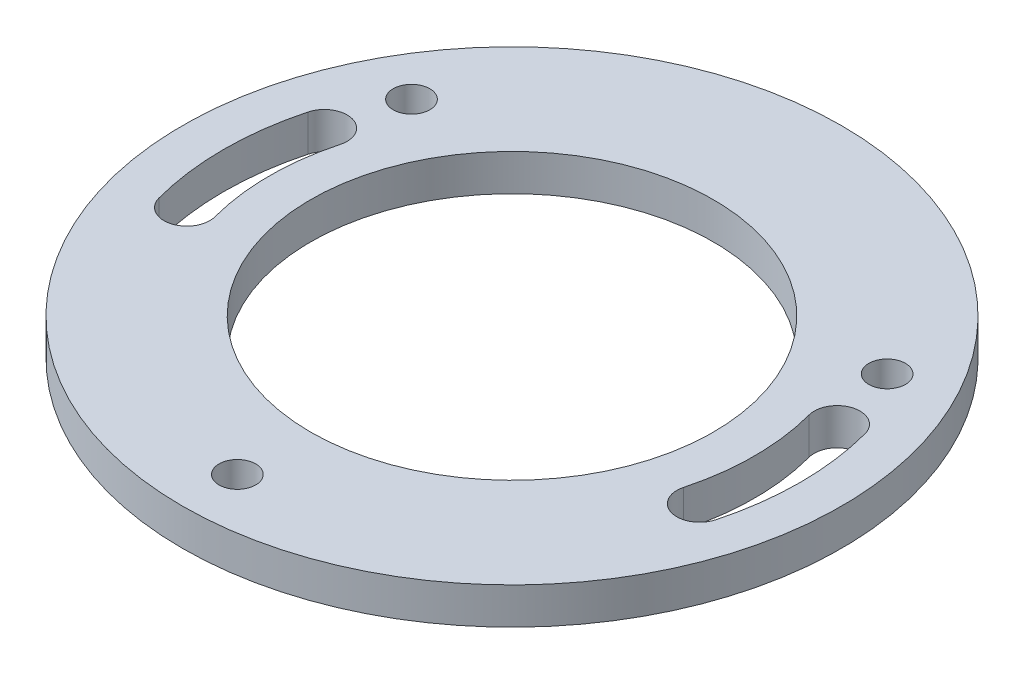
ISO-10303-21;
HEADER;
FILE_DESCRIPTION(('STEP AP214'),'2;1');
FILE_NAME('part.step','',(''),(''),'','','');
FILE_SCHEMA(('AUTOMOTIVE_DESIGN { 1 0 10303 214 1 1 1 1 }'));
ENDSEC;
DATA;
#1=APPLICATION_CONTEXT('core data for automotive mechanical design processes');
#2=APPLICATION_PROTOCOL_DEFINITION('international standard','automotive_design',2000,#1);
#3=PRODUCT_CONTEXT('',#1,'mechanical');
#4=PRODUCT('Part','Part','',(#3));
#5=PRODUCT_RELATED_PRODUCT_CATEGORY('part','',(#4));
#6=PRODUCT_DEFINITION_FORMATION('','',#4);
#7=PRODUCT_DEFINITION_CONTEXT('part definition',#1,'design');
#8=PRODUCT_DEFINITION('design','',#6,#7);
#9=PRODUCT_DEFINITION_SHAPE('','',#8);
#10=(LENGTH_UNIT() NAMED_UNIT(*) SI_UNIT(.MILLI.,.METRE.));
#11=(NAMED_UNIT(*) PLANE_ANGLE_UNIT() SI_UNIT($,.RADIAN.));
#12=(NAMED_UNIT(*) SI_UNIT($,.STERADIAN.) SOLID_ANGLE_UNIT());
#13=UNCERTAINTY_MEASURE_WITH_UNIT(LENGTH_MEASURE(1.E-05),#10,'distance_accuracy_value','');
#14=(GEOMETRIC_REPRESENTATION_CONTEXT(3) GLOBAL_UNCERTAINTY_ASSIGNED_CONTEXT((#13)) GLOBAL_UNIT_ASSIGNED_CONTEXT((#10,
#11,#12)) REPRESENTATION_CONTEXT('',''));
#15=CARTESIAN_POINT('',(0.,0.,0.));
#16=DIRECTION('',(0.,0.,1.));
#17=DIRECTION('',(1.,0.,0.));
#18=AXIS2_PLACEMENT_3D('',#15,#16,#17);
#19=CARTESIAN_POINT('',(0.,4.,0.));
#20=DIRECTION('',(0.,1.,0.));
#21=DIRECTION('',(0.,0.,1.));
#22=AXIS2_PLACEMENT_3D('',#19,#20,#21);
#23=PLANE('',#22);
#24=CARTESIAN_POINT('',(25.9807621135332,4.,-15.));
#25=DIRECTION('',(0.,1.,0.));
#26=DIRECTION('',(0.,0.,1.));
#27=AXIS2_PLACEMENT_3D('',#24,#25,#26);
#28=CIRCLE('',#27,2.);
#29=CARTESIAN_POINT('',(25.9807621135332,4.,-13.));
#30=VERTEX_POINT('',#29);
#31=EDGE_CURVE('E140',#30,#30,#28,.T.);
#32=ORIENTED_EDGE('',*,*,#31,.F.);
#33=EDGE_LOOP('',(#32));
#34=FACE_BOUND('',#33,.T.);
#35=CARTESIAN_POINT('',(0.,4.,0.));
#36=DIRECTION('',(0.,1.,0.));
#37=DIRECTION('',(0.,0.,1.));
#38=AXIS2_PLACEMENT_3D('',#35,#36,#37);
#39=CIRCLE('',#38,22.);
#40=CARTESIAN_POINT('',(0.,4.,22.));
#41=VERTEX_POINT('',#40);
#42=EDGE_CURVE('E207',#41,#41,#39,.T.);
#43=ORIENTED_EDGE('',*,*,#42,.F.);
#44=EDGE_LOOP('',(#43));
#45=FACE_BOUND('',#44,.T.);
#46=CARTESIAN_POINT('',(0.,4.,0.));
#47=DIRECTION('',(0.,1.,0.));
#48=DIRECTION('',(0.,0.,1.));
#49=AXIS2_PLACEMENT_3D('',#46,#47,#48);
#50=CIRCLE('',#49,36.);
#51=CARTESIAN_POINT('',(0.,4.,36.));
#52=VERTEX_POINT('',#51);
#53=EDGE_CURVE('E11',#52,#52,#50,.T.);
#54=ORIENTED_EDGE('',*,*,#53,.T.);
#55=EDGE_LOOP('',(#54));
#56=FACE_BOUND('',#55,.T.);
#57=CARTESIAN_POINT('',(-25.9807621135332,4.,-15.));
#58=DIRECTION('',(0.,1.,0.));
#59=DIRECTION('',(0.,0.,1.));
#60=AXIS2_PLACEMENT_3D('',#57,#58,#59);
#61=CIRCLE('',#60,2.);
#62=CARTESIAN_POINT('',(-25.9807621135332,4.,-13.));
#63=VERTEX_POINT('',#62);
#64=EDGE_CURVE('E199',#63,#63,#61,.T.);
#65=ORIENTED_EDGE('',*,*,#64,.F.);
#66=EDGE_LOOP('',(#65));
#67=FACE_BOUND('',#66,.T.);
#68=CARTESIAN_POINT('',(0.,4.,0.));
#69=DIRECTION('',(0.,1.,0.));
#70=DIRECTION('',(0.,0.,1.));
#71=AXIS2_PLACEMENT_3D('',#68,#69,#70);
#72=CIRCLE('',#71,31.5);
#73=CARTESIAN_POINT('',(-30.4266635281057,4.,-8.15279992072943));
#74=VERTEX_POINT('',#73);
#75=CARTESIAN_POINT('',(-30.4266635281057,4.,8.15279992072942));
#76=VERTEX_POINT('',#75);
#77=EDGE_CURVE('E159',#74,#76,#72,.T.);
#78=ORIENTED_EDGE('',*,*,#77,.F.);
#79=CARTESIAN_POINT('',(-28.011848962383,4.,-7.50575230797312));
#80=DIRECTION('',(0.,1.,0.));
#81=DIRECTION('',(0.,0.,1.));
#82=AXIS2_PLACEMENT_3D('',#79,#80,#81);
#83=CIRCLE('',#82,2.5);
#84=CARTESIAN_POINT('',(-25.5970343966603,4.,-6.85870469521682));
#85=VERTEX_POINT('',#84);
#86=EDGE_CURVE('E156',#85,#74,#83,.T.);
#87=ORIENTED_EDGE('',*,*,#86,.F.);
#88=CARTESIAN_POINT('',(0.,4.,0.));
#89=DIRECTION('',(0.,-1.,0.));
#90=DIRECTION('',(0.,0.,1.));
#91=AXIS2_PLACEMENT_3D('',#88,#89,#90);
#92=CIRCLE('',#91,26.5);
#93=CARTESIAN_POINT('',(-25.5970343966603,4.,6.85870469521682));
#94=VERTEX_POINT('',#93);
#95=EDGE_CURVE('E167',#94,#85,#92,.T.);
#96=ORIENTED_EDGE('',*,*,#95,.F.);
#97=CARTESIAN_POINT('',(-28.011848962383,4.,7.50575230797312));
#98=DIRECTION('',(0.,1.,0.));
#99=DIRECTION('',(0.,0.,1.));
#100=AXIS2_PLACEMENT_3D('',#97,#98,#99);
#101=CIRCLE('',#100,2.5);
#102=EDGE_CURVE('E163',#76,#94,#101,.T.);
#103=ORIENTED_EDGE('',*,*,#102,.F.);
#104=EDGE_LOOP('',(#78,#87,#96,#103));
#105=FACE_BOUND('',#104,.T.);
#106=CARTESIAN_POINT('',(0.,4.,0.));
#107=DIRECTION('',(0.,-1.,0.));
#108=DIRECTION('',(0.,0.,-1.));
#109=AXIS2_PLACEMENT_3D('',#106,#107,#108);
#110=CIRCLE('',#109,26.5);
#111=CARTESIAN_POINT('',(25.5970343966603,4.,-6.85870469521682));
#112=VERTEX_POINT('',#111);
#113=CARTESIAN_POINT('',(25.5970343966603,4.,6.85870469521682));
#114=VERTEX_POINT('',#113);
#115=EDGE_CURVE('E114',#112,#114,#110,.T.);
#116=ORIENTED_EDGE('',*,*,#115,.F.);
#117=CARTESIAN_POINT('',(28.011848962383,4.,-7.50575230797312));
#118=DIRECTION('',(0.,1.,0.));
#119=DIRECTION('',(0.,0.,-1.));
#120=AXIS2_PLACEMENT_3D('',#117,#118,#119);
#121=CIRCLE('',#120,2.5);
#122=CARTESIAN_POINT('',(30.4266635281057,4.,-8.15279992072943));
#123=VERTEX_POINT('',#122);
#124=EDGE_CURVE('E105',#123,#112,#121,.T.);
#125=ORIENTED_EDGE('',*,*,#124,.F.);
#126=CARTESIAN_POINT('',(0.,4.,0.));
#127=DIRECTION('',(0.,1.,0.));
#128=DIRECTION('',(0.,0.,-1.));
#129=AXIS2_PLACEMENT_3D('',#126,#127,#128);
#130=CIRCLE('',#129,31.5);
#131=CARTESIAN_POINT('',(30.4266635281057,4.,8.15279992072942));
#132=VERTEX_POINT('',#131);
#133=EDGE_CURVE('E132',#132,#123,#130,.T.);
#134=ORIENTED_EDGE('',*,*,#133,.F.);
#135=CARTESIAN_POINT('',(28.011848962383,4.,7.50575230797312));
#136=DIRECTION('',(0.,1.,0.));
#137=DIRECTION('',(0.,0.,-1.));
#138=AXIS2_PLACEMENT_3D('',#135,#136,#137);
#139=CIRCLE('',#138,2.5);
#140=EDGE_CURVE('E128',#114,#132,#139,.T.);
#141=ORIENTED_EDGE('',*,*,#140,.F.);
#142=EDGE_LOOP('',(#116,#125,#134,#141));
#143=FACE_BOUND('',#142,.T.);
#144=CARTESIAN_POINT('',(0.,4.,30.));
#145=DIRECTION('',(0.,1.,0.));
#146=DIRECTION('',(0.,0.,1.));
#147=AXIS2_PLACEMENT_3D('',#144,#145,#146);
#148=CIRCLE('',#147,2.);
#149=CARTESIAN_POINT('',(0.,4.,32.));
#150=VERTEX_POINT('',#149);
#151=EDGE_CURVE('E352',#150,#150,#148,.T.);
#152=ORIENTED_EDGE('',*,*,#151,.F.);
#153=EDGE_LOOP('',(#152));
#154=FACE_BOUND('',#153,.T.);
#155=ADVANCED_FACE('F39',(#34,#45,#56,#67,#105,#143,#154),#23,.T.);
#156=CARTESIAN_POINT('',(0.,0.,0.));
#157=DIRECTION('',(0.,1.,0.));
#158=DIRECTION('',(0.,0.,1.));
#159=AXIS2_PLACEMENT_3D('',#156,#157,#158);
#160=PLANE('',#159);
#161=CARTESIAN_POINT('',(-28.011848962383,0.,-7.50575230797312));
#162=DIRECTION('',(0.,1.,0.));
#163=DIRECTION('',(0.,0.,1.));
#164=AXIS2_PLACEMENT_3D('',#161,#162,#163);
#165=CIRCLE('',#164,2.5);
#166=CARTESIAN_POINT('',(-25.5970343966603,0.,-6.85870469521682));
#167=VERTEX_POINT('',#166);
#168=CARTESIAN_POINT('',(-30.4266635281057,0.,-8.15279992072943));
#169=VERTEX_POINT('',#168);
#170=EDGE_CURVE('E123',#167,#169,#165,.T.);
#171=ORIENTED_EDGE('',*,*,#170,.T.);
#172=CARTESIAN_POINT('',(0.,0.,0.));
#173=DIRECTION('',(0.,1.,0.));
#174=DIRECTION('',(0.,0.,1.));
#175=AXIS2_PLACEMENT_3D('',#172,#173,#174);
#176=CIRCLE('',#175,31.5);
#177=CARTESIAN_POINT('',(-30.4266635281057,0.,8.15279992072942));
#178=VERTEX_POINT('',#177);
#179=EDGE_CURVE('E174',#169,#178,#176,.T.);
#180=ORIENTED_EDGE('',*,*,#179,.T.);
#181=CARTESIAN_POINT('',(-28.011848962383,0.,7.50575230797312));
#182=DIRECTION('',(0.,1.,0.));
#183=DIRECTION('',(0.,0.,1.));
#184=AXIS2_PLACEMENT_3D('',#181,#182,#183);
#185=CIRCLE('',#184,2.5);
#186=CARTESIAN_POINT('',(-25.5970343966603,0.,6.85870469521682));
#187=VERTEX_POINT('',#186);
#188=EDGE_CURVE('E178',#178,#187,#185,.T.);
#189=ORIENTED_EDGE('',*,*,#188,.T.);
#190=CARTESIAN_POINT('',(0.,0.,0.));
#191=DIRECTION('',(0.,-1.,0.));
#192=DIRECTION('',(0.,0.,1.));
#193=AXIS2_PLACEMENT_3D('',#190,#191,#192);
#194=CIRCLE('',#193,26.5);
#195=EDGE_CURVE('E160',#187,#167,#194,.T.);
#196=ORIENTED_EDGE('',*,*,#195,.T.);
#197=EDGE_LOOP('',(#171,#180,#189,#196));
#198=FACE_BOUND('',#197,.T.);
#199=CARTESIAN_POINT('',(0.,0.,0.));
#200=DIRECTION('',(0.,1.,0.));
#201=DIRECTION('',(0.,0.,1.));
#202=AXIS2_PLACEMENT_3D('',#199,#200,#201);
#203=CIRCLE('',#202,36.);
#204=CARTESIAN_POINT('',(0.,0.,36.));
#205=VERTEX_POINT('',#204);
#206=EDGE_CURVE('E43',#205,#205,#203,.T.);
#207=ORIENTED_EDGE('',*,*,#206,.F.);
#208=EDGE_LOOP('',(#207));
#209=FACE_BOUND('',#208,.T.);
#210=CARTESIAN_POINT('',(0.,0.,0.));
#211=DIRECTION('',(0.,1.,0.));
#212=DIRECTION('',(0.,0.,1.));
#213=AXIS2_PLACEMENT_3D('',#210,#211,#212);
#214=CIRCLE('',#213,22.);
#215=CARTESIAN_POINT('',(0.,0.,22.));
#216=VERTEX_POINT('',#215);
#217=EDGE_CURVE('E203',#216,#216,#214,.T.);
#218=ORIENTED_EDGE('',*,*,#217,.T.);
#219=EDGE_LOOP('',(#218));
#220=FACE_BOUND('',#219,.T.);
#221=CARTESIAN_POINT('',(-25.9807621135332,0.,-15.));
#222=DIRECTION('',(0.,1.,0.));
#223=DIRECTION('',(0.,0.,1.));
#224=AXIS2_PLACEMENT_3D('',#221,#222,#223);
#225=CIRCLE('',#224,2.);
#226=CARTESIAN_POINT('',(-25.9807621135332,0.,-13.));
#227=VERTEX_POINT('',#226);
#228=EDGE_CURVE('E198',#227,#227,#225,.T.);
#229=ORIENTED_EDGE('',*,*,#228,.T.);
#230=EDGE_LOOP('',(#229));
#231=FACE_BOUND('',#230,.T.);
#232=CARTESIAN_POINT('',(28.011848962383,0.,-7.50575230797312));
#233=DIRECTION('',(0.,1.,0.));
#234=DIRECTION('',(0.,0.,-1.));
#235=AXIS2_PLACEMENT_3D('',#232,#233,#234);
#236=CIRCLE('',#235,2.5);
#237=CARTESIAN_POINT('',(30.4266635281057,0.,-8.15279992072943));
#238=VERTEX_POINT('',#237);
#239=CARTESIAN_POINT('',(25.5970343966603,0.,-6.85870469521682));
#240=VERTEX_POINT('',#239);
#241=EDGE_CURVE('E63',#238,#240,#236,.T.);
#242=ORIENTED_EDGE('',*,*,#241,.T.);
#243=CARTESIAN_POINT('',(0.,0.,0.));
#244=DIRECTION('',(0.,-1.,0.));
#245=DIRECTION('',(0.,0.,-1.));
#246=AXIS2_PLACEMENT_3D('',#243,#244,#245);
#247=CIRCLE('',#246,26.5);
#248=CARTESIAN_POINT('',(25.5970343966603,0.,6.85870469521682));
#249=VERTEX_POINT('',#248);
#250=EDGE_CURVE('E121',#240,#249,#247,.T.);
#251=ORIENTED_EDGE('',*,*,#250,.T.);
#252=CARTESIAN_POINT('',(28.011848962383,0.,7.50575230797312));
#253=DIRECTION('',(0.,1.,0.));
#254=DIRECTION('',(0.,0.,-1.));
#255=AXIS2_PLACEMENT_3D('',#252,#253,#254);
#256=CIRCLE('',#255,2.5);
#257=CARTESIAN_POINT('',(30.4266635281057,0.,8.15279992072942));
#258=VERTEX_POINT('',#257);
#259=EDGE_CURVE('E143',#249,#258,#256,.T.);
#260=ORIENTED_EDGE('',*,*,#259,.T.);
#261=CARTESIAN_POINT('',(0.,0.,0.));
#262=DIRECTION('',(0.,1.,0.));
#263=DIRECTION('',(0.,0.,-1.));
#264=AXIS2_PLACEMENT_3D('',#261,#262,#263);
#265=CIRCLE('',#264,31.5);
#266=EDGE_CURVE('E115',#258,#238,#265,.T.);
#267=ORIENTED_EDGE('',*,*,#266,.T.);
#268=EDGE_LOOP('',(#242,#251,#260,#267));
#269=FACE_BOUND('',#268,.T.);
#270=CARTESIAN_POINT('',(25.9807621135332,0.,-15.));
#271=DIRECTION('',(0.,1.,0.));
#272=DIRECTION('',(0.,0.,1.));
#273=AXIS2_PLACEMENT_3D('',#270,#271,#272);
#274=CIRCLE('',#273,2.);
#275=CARTESIAN_POINT('',(25.9807621135332,0.,-13.));
#276=VERTEX_POINT('',#275);
#277=EDGE_CURVE('E360',#276,#276,#274,.T.);
#278=ORIENTED_EDGE('',*,*,#277,.T.);
#279=EDGE_LOOP('',(#278));
#280=FACE_BOUND('',#279,.T.);
#281=CARTESIAN_POINT('',(0.,0.,30.));
#282=DIRECTION('',(0.,1.,0.));
#283=DIRECTION('',(0.,0.,1.));
#284=AXIS2_PLACEMENT_3D('',#281,#282,#283);
#285=CIRCLE('',#284,2.);
#286=CARTESIAN_POINT('',(0.,0.,32.));
#287=VERTEX_POINT('',#286);
#288=EDGE_CURVE('E355',#287,#287,#285,.T.);
#289=ORIENTED_EDGE('',*,*,#288,.T.);
#290=EDGE_LOOP('',(#289));
#291=FACE_BOUND('',#290,.T.);
#292=ADVANCED_FACE('F215',(#198,#209,#220,#231,#269,#280,#291),#160,.F.);
#293=CARTESIAN_POINT('',(0.,4.,0.));
#294=DIRECTION('',(0.,-1.,0.));
#295=DIRECTION('',(0.,0.,-1.));
#296=AXIS2_PLACEMENT_3D('',#293,#294,#295);
#297=CYLINDRICAL_SURFACE('',#296,36.);
#298=ORIENTED_EDGE('',*,*,#53,.F.);
#299=EDGE_LOOP('',(#298));
#300=FACE_BOUND('',#299,.T.);
#301=ORIENTED_EDGE('',*,*,#206,.T.);
#302=EDGE_LOOP('',(#301));
#303=FACE_BOUND('',#302,.T.);
#304=ADVANCED_FACE('F41',(#300,#303),#297,.T.);
#305=CARTESIAN_POINT('',(0.,4.,0.));
#306=DIRECTION('',(0.,-1.,0.));
#307=DIRECTION('',(0.,0.,-1.));
#308=AXIS2_PLACEMENT_3D('',#305,#306,#307);
#309=CYLINDRICAL_SURFACE('',#308,22.);
#310=ORIENTED_EDGE('',*,*,#42,.T.);
#311=EDGE_LOOP('',(#310));
#312=FACE_BOUND('',#311,.T.);
#313=ORIENTED_EDGE('',*,*,#217,.F.);
#314=EDGE_LOOP('',(#313));
#315=FACE_BOUND('',#314,.T.);
#316=ADVANCED_FACE('F218',(#312,#315),#309,.F.);
#317=CARTESIAN_POINT('',(-25.9807621135332,4.,-15.));
#318=DIRECTION('',(0.,-1.,0.));
#319=DIRECTION('',(0.,0.,-1.));
#320=AXIS2_PLACEMENT_3D('',#317,#318,#319);
#321=CYLINDRICAL_SURFACE('',#320,2.);
#322=ORIENTED_EDGE('',*,*,#64,.T.);
#323=EDGE_LOOP('',(#322));
#324=FACE_BOUND('',#323,.T.);
#325=ORIENTED_EDGE('',*,*,#228,.F.);
#326=EDGE_LOOP('',(#325));
#327=FACE_BOUND('',#326,.T.);
#328=ADVANCED_FACE('F220',(#324,#327),#321,.F.);
#329=CARTESIAN_POINT('',(-28.011848962383,4.,-7.50575230797312));
#330=DIRECTION('',(0.,-1.,0.));
#331=DIRECTION('',(0.,0.,-1.));
#332=AXIS2_PLACEMENT_3D('',#329,#330,#331);
#333=CYLINDRICAL_SURFACE('',#332,2.5);
#334=ORIENTED_EDGE('',*,*,#170,.F.);
#335=DIRECTION('',(0.,-1.,0.));
#336=VECTOR('',#335,1.);
#337=CARTESIAN_POINT('',(-25.5970343966603,4.,-6.85870469521682));
#338=LINE('',#337,#336);
#339=EDGE_CURVE('E170',#85,#167,#338,.T.);
#340=ORIENTED_EDGE('',*,*,#339,.F.);
#341=ORIENTED_EDGE('',*,*,#86,.T.);
#342=DIRECTION('',(0.,-1.,0.));
#343=VECTOR('',#342,1.);
#344=CARTESIAN_POINT('',(-30.4266635281057,4.,-8.15279992072943));
#345=LINE('',#344,#343);
#346=EDGE_CURVE('E194',#74,#169,#345,.T.);
#347=ORIENTED_EDGE('',*,*,#346,.T.);
#348=EDGE_LOOP('',(#334,#340,#341,#347));
#349=FACE_BOUND('',#348,.T.);
#350=ADVANCED_FACE('F227',(#349),#333,.F.);
#351=CARTESIAN_POINT('',(0.,4.,0.));
#352=DIRECTION('',(0.,-1.,0.));
#353=DIRECTION('',(0.,0.,-1.));
#354=AXIS2_PLACEMENT_3D('',#351,#352,#353);
#355=CYLINDRICAL_SURFACE('',#354,31.5);
#356=ORIENTED_EDGE('',*,*,#179,.F.);
#357=ORIENTED_EDGE('',*,*,#346,.F.);
#358=ORIENTED_EDGE('',*,*,#77,.T.);
#359=DIRECTION('',(0.,-1.,0.));
#360=VECTOR('',#359,1.);
#361=CARTESIAN_POINT('',(-30.4266635281057,4.,8.15279992072942));
#362=LINE('',#361,#360);
#363=EDGE_CURVE('E191',#76,#178,#362,.T.);
#364=ORIENTED_EDGE('',*,*,#363,.T.);
#365=EDGE_LOOP('',(#356,#357,#358,#364));
#366=FACE_BOUND('',#365,.T.);
#367=ADVANCED_FACE('F254',(#366),#355,.F.);
#368=CARTESIAN_POINT('',(-28.011848962383,4.,7.50575230797312));
#369=DIRECTION('',(0.,-1.,0.));
#370=DIRECTION('',(0.,0.,-1.));
#371=AXIS2_PLACEMENT_3D('',#368,#369,#370);
#372=CYLINDRICAL_SURFACE('',#371,2.5);
#373=ORIENTED_EDGE('',*,*,#188,.F.);
#374=ORIENTED_EDGE('',*,*,#363,.F.);
#375=ORIENTED_EDGE('',*,*,#102,.T.);
#376=DIRECTION('',(0.,-1.,0.));
#377=VECTOR('',#376,1.);
#378=CARTESIAN_POINT('',(-25.5970343966603,4.,6.85870469521682));
#379=LINE('',#378,#377);
#380=EDGE_CURVE('E188',#94,#187,#379,.T.);
#381=ORIENTED_EDGE('',*,*,#380,.T.);
#382=EDGE_LOOP('',(#373,#374,#375,#381));
#383=FACE_BOUND('',#382,.T.);
#384=ADVANCED_FACE('F257',(#383),#372,.F.);
#385=CARTESIAN_POINT('',(0.,4.,0.));
#386=DIRECTION('',(0.,-1.,0.));
#387=DIRECTION('',(0.,0.,-1.));
#388=AXIS2_PLACEMENT_3D('',#385,#386,#387);
#389=CYLINDRICAL_SURFACE('',#388,26.5);
#390=ORIENTED_EDGE('',*,*,#195,.F.);
#391=ORIENTED_EDGE('',*,*,#380,.F.);
#392=ORIENTED_EDGE('',*,*,#95,.T.);
#393=ORIENTED_EDGE('',*,*,#339,.T.);
#394=EDGE_LOOP('',(#390,#391,#392,#393));
#395=FACE_BOUND('',#394,.T.);
#396=ADVANCED_FACE('F263',(#395),#389,.T.);
#397=CARTESIAN_POINT('',(28.011848962383,4.,-7.50575230797312));
#398=DIRECTION('',(0.,-1.,0.));
#399=DIRECTION('',(0.,0.,-1.));
#400=AXIS2_PLACEMENT_3D('',#397,#398,#399);
#401=CYLINDRICAL_SURFACE('',#400,2.5);
#402=ORIENTED_EDGE('',*,*,#241,.F.);
#403=DIRECTION('',(0.,-1.,0.));
#404=VECTOR('',#403,1.);
#405=CARTESIAN_POINT('',(30.4266635281057,4.,-8.15279992072943));
#406=LINE('',#405,#404);
#407=EDGE_CURVE('E109',#123,#238,#406,.T.);
#408=ORIENTED_EDGE('',*,*,#407,.F.);
#409=ORIENTED_EDGE('',*,*,#124,.T.);
#410=DIRECTION('',(0.,-1.,0.));
#411=VECTOR('',#410,1.);
#412=CARTESIAN_POINT('',(25.5970343966603,4.,-6.85870469521682));
#413=LINE('',#412,#411);
#414=EDGE_CURVE('E108',#112,#240,#413,.T.);
#415=ORIENTED_EDGE('',*,*,#414,.T.);
#416=EDGE_LOOP('',(#402,#408,#409,#415));
#417=FACE_BOUND('',#416,.T.);
#418=ADVANCED_FACE('F107',(#417),#401,.F.);
#419=CARTESIAN_POINT('',(0.,4.,0.));
#420=DIRECTION('',(0.,-1.,0.));
#421=DIRECTION('',(0.,0.,-1.));
#422=AXIS2_PLACEMENT_3D('',#419,#420,#421);
#423=CYLINDRICAL_SURFACE('',#422,26.5);
#424=ORIENTED_EDGE('',*,*,#250,.F.);
#425=ORIENTED_EDGE('',*,*,#414,.F.);
#426=ORIENTED_EDGE('',*,*,#115,.T.);
#427=DIRECTION('',(0.,-1.,0.));
#428=VECTOR('',#427,1.);
#429=CARTESIAN_POINT('',(25.5970343966603,4.,6.85870469521682));
#430=LINE('',#429,#428);
#431=EDGE_CURVE('E124',#114,#249,#430,.T.);
#432=ORIENTED_EDGE('',*,*,#431,.T.);
#433=EDGE_LOOP('',(#424,#425,#426,#432));
#434=FACE_BOUND('',#433,.T.);
#435=ADVANCED_FACE('F118',(#434),#423,.T.);
#436=CARTESIAN_POINT('',(28.011848962383,4.,7.50575230797312));
#437=DIRECTION('',(0.,-1.,0.));
#438=DIRECTION('',(0.,0.,-1.));
#439=AXIS2_PLACEMENT_3D('',#436,#437,#438);
#440=CYLINDRICAL_SURFACE('',#439,2.5);
#441=ORIENTED_EDGE('',*,*,#259,.F.);
#442=ORIENTED_EDGE('',*,*,#431,.F.);
#443=ORIENTED_EDGE('',*,*,#140,.T.);
#444=DIRECTION('',(0.,-1.,0.));
#445=VECTOR('',#444,1.);
#446=CARTESIAN_POINT('',(30.4266635281057,4.,8.15279992072942));
#447=LINE('',#446,#445);
#448=EDGE_CURVE('E55',#132,#258,#447,.T.);
#449=ORIENTED_EDGE('',*,*,#448,.T.);
#450=EDGE_LOOP('',(#441,#442,#443,#449));
#451=FACE_BOUND('',#450,.T.);
#452=ADVANCED_FACE('F308',(#451),#440,.F.);
#453=CARTESIAN_POINT('',(0.,4.,0.));
#454=DIRECTION('',(0.,-1.,0.));
#455=DIRECTION('',(0.,0.,-1.));
#456=AXIS2_PLACEMENT_3D('',#453,#454,#455);
#457=CYLINDRICAL_SURFACE('',#456,31.5);
#458=ORIENTED_EDGE('',*,*,#266,.F.);
#459=ORIENTED_EDGE('',*,*,#448,.F.);
#460=ORIENTED_EDGE('',*,*,#133,.T.);
#461=ORIENTED_EDGE('',*,*,#407,.T.);
#462=EDGE_LOOP('',(#458,#459,#460,#461));
#463=FACE_BOUND('',#462,.T.);
#464=ADVANCED_FACE('F316',(#463),#457,.F.);
#465=CARTESIAN_POINT('',(25.9807621135332,4.,-15.));
#466=DIRECTION('',(0.,-1.,0.));
#467=DIRECTION('',(0.,0.,-1.));
#468=AXIS2_PLACEMENT_3D('',#465,#466,#467);
#469=CYLINDRICAL_SURFACE('',#468,2.);
#470=ORIENTED_EDGE('',*,*,#31,.T.);
#471=EDGE_LOOP('',(#470));
#472=FACE_BOUND('',#471,.T.);
#473=ORIENTED_EDGE('',*,*,#277,.F.);
#474=EDGE_LOOP('',(#473));
#475=FACE_BOUND('',#474,.T.);
#476=ADVANCED_FACE('F326',(#472,#475),#469,.F.);
#477=CARTESIAN_POINT('',(0.,4.,30.));
#478=DIRECTION('',(0.,-1.,0.));
#479=DIRECTION('',(0.,0.,-1.));
#480=AXIS2_PLACEMENT_3D('',#477,#478,#479);
#481=CYLINDRICAL_SURFACE('',#480,2.);
#482=ORIENTED_EDGE('',*,*,#151,.T.);
#483=EDGE_LOOP('',(#482));
#484=FACE_BOUND('',#483,.T.);
#485=ORIENTED_EDGE('',*,*,#288,.F.);
#486=EDGE_LOOP('',(#485));
#487=FACE_BOUND('',#486,.T.);
#488=ADVANCED_FACE('F335',(#484,#487),#481,.F.);
#489=CLOSED_SHELL('',(#155,#292,#304,#316,#328,#350,#367,#384,#396,#418,#435,#452,#464,#476,#488));
#490=MANIFOLD_SOLID_BREP('B2',#489);
#491=ADVANCED_BREP_SHAPE_REPRESENTATION('',(#18,#490),#14);
#492=SHAPE_DEFINITION_REPRESENTATION(#9,#491);
ENDSEC;
END-ISO-10303-21;
